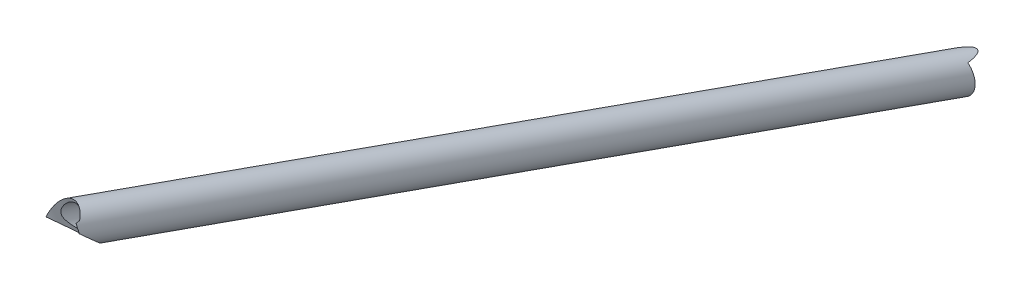
ISO-10303-21;
HEADER;
FILE_DESCRIPTION(('STEP AP214'),'2;1');
FILE_NAME('part.step','',(''),(''),'','','');
FILE_SCHEMA(('AUTOMOTIVE_DESIGN { 1 0 10303 214 1 1 1 1 }'));
ENDSEC;
DATA;
#1=APPLICATION_CONTEXT('core data for automotive mechanical design processes');
#2=APPLICATION_PROTOCOL_DEFINITION('international standard','automotive_design',2000,#1);
#3=PRODUCT_CONTEXT('',#1,'mechanical');
#4=PRODUCT('Part','Part','',(#3));
#5=PRODUCT_RELATED_PRODUCT_CATEGORY('part','',(#4));
#6=PRODUCT_DEFINITION_FORMATION('','',#4);
#7=PRODUCT_DEFINITION_CONTEXT('part definition',#1,'design');
#8=PRODUCT_DEFINITION('design','',#6,#7);
#9=PRODUCT_DEFINITION_SHAPE('','',#8);
#10=(LENGTH_UNIT() NAMED_UNIT(*) SI_UNIT(.MILLI.,.METRE.));
#11=(NAMED_UNIT(*) PLANE_ANGLE_UNIT() SI_UNIT($,.RADIAN.));
#12=(NAMED_UNIT(*) SI_UNIT($,.STERADIAN.) SOLID_ANGLE_UNIT());
#13=UNCERTAINTY_MEASURE_WITH_UNIT(LENGTH_MEASURE(1.E-05),#10,'distance_accuracy_value','');
#14=(GEOMETRIC_REPRESENTATION_CONTEXT(3) GLOBAL_UNCERTAINTY_ASSIGNED_CONTEXT((#13)) GLOBAL_UNIT_ASSIGNED_CONTEXT((#10,
#11,#12)) REPRESENTATION_CONTEXT('',''));
#15=CARTESIAN_POINT('',(0.,0.,0.));
#16=DIRECTION('',(0.,0.,1.));
#17=DIRECTION('',(1.,0.,0.));
#18=AXIS2_PLACEMENT_3D('',#15,#16,#17);
#19=CARTESIAN_POINT('',(-324.999999999997,320.000000000001,-1580.));
#20=DIRECTION('',(0.1711521568645,-0.228202875819355,-0.958452078441278));
#21=DIRECTION('',(0.,0.972806214685366,-0.231620527306043));
#22=AXIS2_PLACEMENT_3D('',#19,#20,#21);
#23=CYLINDRICAL_SURFACE('',#22,7.90000000000002);
#24=CARTESIAN_POINT('',(-323.966645789436,326.307363481934,-1587.61658574486));
#25=CARTESIAN_POINT('',(-324.175612977549,326.296705939446,-1587.66135152366));
#26=CARTESIAN_POINT('',(-324.385130251522,326.278194307406,-1587.70161499438));
#27=CARTESIAN_POINT('',(-324.803806167485,326.225592666959,-1587.77270181412));
#28=CARTESIAN_POINT('',(-325.012964831545,326.191503654473,-1587.80352576643));
#29=CARTESIAN_POINT('',(-325.429331243801,326.108009417741,-1587.85546586048));
#30=CARTESIAN_POINT('',(-325.636539738196,326.058610319407,-1587.87658587662));
#31=CARTESIAN_POINT('',(-326.047590361872,325.944851065946,-1587.90907319574));
#32=CARTESIAN_POINT('',(-326.251432413656,325.880490566916,-1587.9204402745));
#33=CARTESIAN_POINT('',(-326.654114025761,325.737328672349,-1587.93354626768));
#34=CARTESIAN_POINT('',(-326.852957366613,325.658538587955,-1587.9352926905));
#35=CARTESIAN_POINT('',(-327.24439696723,325.487029008777,-1587.92950186717));
#36=CARTESIAN_POINT('',(-327.436993248957,325.39430956297,-1587.92196465367));
#37=CARTESIAN_POINT('',(-327.814648256425,325.195520249694,-1587.89812019173));
#38=CARTESIAN_POINT('',(-327.999705415689,325.089447626242,-1587.88181113057));
#39=CARTESIAN_POINT('',(-328.360996222015,324.864592696473,-1587.84113024388));
#40=CARTESIAN_POINT('',(-328.537229771889,324.745810250209,-1587.81675832955));
#41=CARTESIAN_POINT('',(-328.883171108338,324.493634702971,-1587.76029145554));
#42=CARTESIAN_POINT('',(-329.052675275293,324.359995014688,-1587.72805048995));
#43=CARTESIAN_POINT('',(-329.380138189812,324.08075112603,-1587.6573038662));
#44=CARTESIAN_POINT('',(-329.538096290604,323.935146256375,-1587.61879785748));
#45=CARTESIAN_POINT('',(-329.84141176635,323.632473136908,-1587.53695436931));
#46=CARTESIAN_POINT('',(-329.986763322365,323.475399654368,-1587.49361467959));
#47=CARTESIAN_POINT('',(-330.263661653931,323.150348624936,-1587.40388851808));
#48=CARTESIAN_POINT('',(-330.395210073406,322.982372380406,-1587.35750241018));
#49=CARTESIAN_POINT('',(-330.627647246448,322.657865698545,-1587.2697847315));
#50=CARTESIAN_POINT('',(-330.730309351337,322.502575668912,-1587.22855610938));
#51=CARTESIAN_POINT('',(-330.923382739677,322.184285333027,-1587.14720228871));
#52=CARTESIAN_POINT('',(-331.013795796986,322.021286147808,-1587.10707693107));
#53=CARTESIAN_POINT('',(-331.181361251165,321.688116000308,-1587.03009063708));
#54=CARTESIAN_POINT('',(-331.25853044095,321.517954465976,-1586.99322559592));
#55=CARTESIAN_POINT('',(-331.398745391079,321.170803260724,-1586.92521090062));
#56=CARTESIAN_POINT('',(-331.461795592922,320.993815757687,-1586.89405944967));
#57=CARTESIAN_POINT('',(-331.559469854148,320.677103613812,-1586.84676427926));
#58=CARTESIAN_POINT('',(-331.597284526233,320.538629583804,-1586.82881302873));
#59=CARTESIAN_POINT('',(-331.66380941228,320.258867262344,-1586.7991638688));
#60=CARTESIAN_POINT('',(-331.692522238742,320.11757979083,-1586.78746416437));
#61=CARTESIAN_POINT('',(-331.740548139849,319.833230407489,-1586.77157067904));
#62=CARTESIAN_POINT('',(-331.759877165925,319.690171933828,-1586.76736412787));
#63=CARTESIAN_POINT('',(-331.789143741971,319.403088289108,-1586.76744607019));
#64=CARTESIAN_POINT('',(-331.79908142147,319.259063131411,-1586.7717344465));
#65=CARTESIAN_POINT('',(-331.809779255778,318.97082322096,-1586.78949122765));
#66=CARTESIAN_POINT('',(-331.810513222828,318.826609094365,-1586.80298571225));
#67=CARTESIAN_POINT('',(-331.803221828405,318.539605173905,-1586.83936643546));
#68=CARTESIAN_POINT('',(-331.795196490313,318.39681537624,-1586.86225264899));
#69=CARTESIAN_POINT('',(-331.771095616484,318.113555315602,-1586.91714650043));
#70=CARTESIAN_POINT('',(-331.755011834645,317.973087581173,-1586.94916346722));
#71=CARTESIAN_POINT('',(-331.715644776623,317.695355713713,-1587.0216286884));
#72=CARTESIAN_POINT('',(-331.692358975419,317.558092722443,-1587.0620798982));
#73=CARTESIAN_POINT('',(-331.627381771764,317.225349170743,-1587.17071740639));
#74=CARTESIAN_POINT('',(-331.582142543629,317.031937840523,-1587.24312942584));
#75=CARTESIAN_POINT('',(-331.48073883416,316.653416466329,-1587.40082231095));
#76=CARTESIAN_POINT('',(-331.424567929073,316.468311382421,-1587.48611073649));
#77=CARTESIAN_POINT('',(-331.303062809019,316.10552455763,-1587.6669629705));
#78=CARTESIAN_POINT('',(-331.237697980701,315.927870302185,-1587.76256084794));
#79=CARTESIAN_POINT('',(-331.099355498989,315.57992465588,-1587.96142327384));
#80=CARTESIAN_POINT('',(-331.026374644023,315.409636404385,-1588.06469104121));
#81=CARTESIAN_POINT('',(-330.869346515212,315.065978962611,-1588.28315551532));
#82=CARTESIAN_POINT('',(-330.784901583514,314.893012513581,-1588.39869665499));
#83=CARTESIAN_POINT('',(-330.609396325319,314.5537828984,-1588.63440289004));
#84=CARTESIAN_POINT('',(-330.518336737156,314.387518987317,-1588.75456746864));
#85=CARTESIAN_POINT('',(-330.329960548347,314.0608129571,-1588.9982980938));
#86=CARTESIAN_POINT('',(-330.232637111931,313.90037750775,-1589.12186776934));
#87=CARTESIAN_POINT('',(-330.032087887043,313.584992365596,-1589.3711879964));
#88=CARTESIAN_POINT('',(-329.928862027547,313.43004273884,-1589.49693857415));
#89=CARTESIAN_POINT('',(-329.716512415595,313.12508960845,-1589.74985250671));
#90=CARTESIAN_POINT('',(-329.607382739479,312.975091325141,-1589.87701717481));
#91=CARTESIAN_POINT('',(-329.383309350441,312.679940512798,-1590.13187726606));
#92=CARTESIAN_POINT('',(-329.268365139566,312.534788400561,-1590.2595727338));
#93=CARTESIAN_POINT('',(-329.032661263379,312.249314250809,-1590.51470753869));
#94=CARTESIAN_POINT('',(-328.911905950003,312.108988729665,-1590.64214699527));
#95=CARTESIAN_POINT('',(-328.66432736469,311.833041543756,-1590.89622315239));
#96=CARTESIAN_POINT('',(-328.537503991733,311.697419957367,-1591.02285983952));
#97=CARTESIAN_POINT('',(-328.21896599129,311.370924541441,-1591.33145518049));
#98=CARTESIAN_POINT('',(-328.02376110602,311.18268999951,-1591.51263017509));
#99=CARTESIAN_POINT('',(-327.619033451953,310.817000070192,-1591.86998291677));
#100=CARTESIAN_POINT('',(-327.409507647644,310.639546983229,-1592.04615959312));
#101=CARTESIAN_POINT('',(-326.975472741132,310.297301149023,-1592.39065031246));
#102=CARTESIAN_POINT('',(-326.751005438524,310.132475645248,-1592.55898422181));
#103=CARTESIAN_POINT('',(-326.285134459935,309.817182125931,-1592.8852884936));
#104=CARTESIAN_POINT('',(-326.043740629931,309.666705881853,-1593.04326477915));
#105=CARTESIAN_POINT('',(-325.648985875741,309.443658648031,-1593.28074583644));
#106=CARTESIAN_POINT('',(-325.501840267455,309.365169453412,-1593.36505341305));
#107=CARTESIAN_POINT('',(-325.201117663896,309.214899900372,-1593.52794402021));
#108=CARTESIAN_POINT('',(-325.047542373841,309.143117779285,-1593.60652855361));
#109=CARTESIAN_POINT('',(-324.733741747988,309.007324624023,-1593.75679221043));
#110=CARTESIAN_POINT('',(-324.573518518028,308.943311153847,-1593.82847349702));
#111=CARTESIAN_POINT('',(-324.246371289823,308.824371584972,-1593.96348645221));
#112=CARTESIAN_POINT('',(-324.079449130466,308.769443013343,-1594.026820392));
#113=CARTESIAN_POINT('',(-323.65147324859,308.644704220827,-1594.17344660598));
#114=CARTESIAN_POINT('',(-323.386076249314,308.581724607388,-1594.25029977602));
#115=CARTESIAN_POINT('',(-322.842989705133,308.486749593738,-1594.37377645335));
#116=CARTESIAN_POINT('',(-322.565322666784,308.45469974109,-1594.42045303906));
#117=CARTESIAN_POINT('',(-322.054925997661,308.430486618372,-1594.47125228855));
#118=CARTESIAN_POINT('',(-321.823132172699,308.432167732615,-1594.48153545433));
#119=CARTESIAN_POINT('',(-321.361846473166,308.463088898371,-1594.47403369806));
#120=CARTESIAN_POINT('',(-321.132353023232,308.492308571524,-1594.45626952431));
#121=CARTESIAN_POINT('',(-320.682460385862,308.578315843677,-1594.39226448898));
#122=CARTESIAN_POINT('',(-320.46207042709,308.635130707489,-1594.34599545164));
#123=CARTESIAN_POINT('',(-320.036634042799,308.773618622983,-1594.22746717292));
#124=CARTESIAN_POINT('',(-319.831599940044,308.855311377916,-1594.15518732275));
#125=CARTESIAN_POINT('',(-319.386800679413,309.064513183652,-1593.96613279026));
#126=CARTESIAN_POINT('',(-319.152971552986,309.198443485061,-1593.84258932957));
#127=CARTESIAN_POINT('',(-318.717551677069,309.49050231094,-1593.56996388295));
#128=CARTESIAN_POINT('',(-318.516027681316,309.648679652641,-1593.42083030176));
#129=CARTESIAN_POINT('',(-318.183055775344,309.946133438338,-1593.13891242488));
#130=CARTESIAN_POINT('',(-318.04583371688,310.082231557854,-1593.00943889128));
#131=CARTESIAN_POINT('',(-317.788227544249,310.362384426669,-1592.74245067169));
#132=CARTESIAN_POINT('',(-317.667853755288,310.506443980246,-1592.60493112737));
#133=CARTESIAN_POINT('',(-317.442132925257,310.800840149884,-1592.32387058368));
#134=CARTESIAN_POINT('',(-317.336811701034,310.951186991932,-1592.1803197728));
#135=CARTESIAN_POINT('',(-317.139793334317,311.256697896399,-1591.88898098236));
#136=CARTESIAN_POINT('',(-317.048101353312,311.411863757056,-1591.7411914227));
#137=CARTESIAN_POINT('',(-316.883534442451,311.714047712312,-1591.45407601125));
#138=CARTESIAN_POINT('',(-316.809757302504,311.860783278972,-1591.31496555731));
#139=CARTESIAN_POINT('',(-316.67173259803,312.157068565761,-1591.03498909851));
#140=CARTESIAN_POINT('',(-316.60748669835,312.306618772402,-1590.89412279159));
#141=CARTESIAN_POINT('',(-316.487702945422,312.60826323932,-1590.61120645477));
#142=CARTESIAN_POINT('',(-316.432171108207,312.76035917765,-1590.46915567778));
#143=CARTESIAN_POINT('',(-316.329201042558,313.066780031395,-1590.18451280989));
#144=CARTESIAN_POINT('',(-316.281763759281,313.221105204825,-1590.04192065778));
#145=CARTESIAN_POINT('',(-316.150537683598,313.687911826181,-1589.61344114924));
#146=CARTESIAN_POINT('',(-316.078092646996,314.003560342434,-1589.32747674906));
#147=CARTESIAN_POINT('',(-315.960137102145,314.642867596384,-1588.75940827293));
#148=CARTESIAN_POINT('',(-315.914613515385,314.966522364873,-1588.47730238768));
#149=CARTESIAN_POINT('',(-315.855278432123,315.556399920046,-1587.97751953436));
#150=CARTESIAN_POINT('',(-315.836904586012,315.820939564418,-1587.75839174109));
#151=CARTESIAN_POINT('',(-315.815730245232,316.357043138838,-1587.32788917603));
#152=CARTESIAN_POINT('',(-315.812935121072,316.62860945881,-1587.11651710286));
#153=CARTESIAN_POINT('',(-315.823269721574,317.179372946223,-1586.70605752242));
#154=CARTESIAN_POINT('',(-315.836347935384,317.458542572167,-1586.50693247072));
#155=CARTESIAN_POINT('',(-315.868820568355,317.884927696916,-1586.22132005617));
#156=CARTESIAN_POINT('',(-315.881781928041,318.028286824147,-1586.12831921839));
#157=CARTESIAN_POINT('',(-315.912279156255,318.317833934134,-1585.94764508389));
#158=CARTESIAN_POINT('',(-315.929814147617,318.464021369484,-1585.85997076958));
#159=CARTESIAN_POINT('',(-315.969407882143,318.756347019322,-1585.69289482091));
#160=CARTESIAN_POINT('',(-315.991363539985,318.902421388794,-1585.61335781652));
#161=CARTESIAN_POINT('',(-316.040458216632,319.197581159026,-1585.46188171627));
#162=CARTESIAN_POINT('',(-316.067595632314,319.346665615808,-1585.38994028115));
#163=CARTESIAN_POINT('',(-316.127568921342,319.647646092686,-1585.25529704515));
#164=CARTESIAN_POINT('',(-316.160397920216,319.799538525739,-1585.19258426464));
#165=CARTESIAN_POINT('',(-316.232396442551,320.105936917607,-1585.07807389027));
#166=CARTESIAN_POINT('',(-316.27156476424,320.260442376097,-1585.02627423185));
#167=CARTESIAN_POINT('',(-316.350438126193,320.547797036792,-1584.94224046715));
#168=CARTESIAN_POINT('',(-316.389168764802,320.680392888008,-1584.90823295765));
#169=CARTESIAN_POINT('',(-316.472011982751,320.946100486204,-1584.85033378193));
#170=CARTESIAN_POINT('',(-316.516123177732,321.079212091988,-1584.82643952073));
#171=CARTESIAN_POINT('',(-316.609962282548,321.344826227171,-1584.78944283766));
#172=CARTESIAN_POINT('',(-316.659684840977,321.477329213539,-1584.77633023089));
#173=CARTESIAN_POINT('',(-316.764931077913,321.740660079066,-1584.76108593662));
#174=CARTESIAN_POINT('',(-316.8204548217,321.871487939356,-1584.75895437269));
#175=CARTESIAN_POINT('',(-316.937309370938,322.130222679651,-1584.76538861047));
#176=CARTESIAN_POINT('',(-316.998639217344,322.258130037746,-1584.77395264834));
#177=CARTESIAN_POINT('',(-317.127016751923,322.509946879285,-1584.80101905618));
#178=CARTESIAN_POINT('',(-317.194064533291,322.633856297524,-1584.81952158817));
#179=CARTESIAN_POINT('',(-317.333827930131,322.877006619953,-1584.8654065194));
#180=CARTESIAN_POINT('',(-317.406553077721,322.99623914478,-1584.89280410775));
#181=CARTESIAN_POINT('',(-317.557379298017,323.229203629308,-1584.95519196755));
#182=CARTESIAN_POINT('',(-317.635481806633,323.342934105891,-1584.9901842724));
#183=CARTESIAN_POINT('',(-317.825936814209,323.604391915604,-1585.08018196015));
#184=CARTESIAN_POINT('',(-317.940490438087,323.749603869139,-1585.13785544733));
#185=CARTESIAN_POINT('',(-318.178681272473,324.028515561493,-1585.26167200673));
#186=CARTESIAN_POINT('',(-318.302321687872,324.162211202073,-1585.32781807338));
#187=CARTESIAN_POINT('',(-318.558351250158,324.417973241706,-1585.46590329899));
#188=CARTESIAN_POINT('',(-318.690748938683,324.540027994575,-1585.53784812932));
#189=CARTESIAN_POINT('',(-318.963750725271,324.77226389219,-1585.68515294859));
#190=CARTESIAN_POINT('',(-319.104354120496,324.882446051553,-1585.76051264491));
#191=CARTESIAN_POINT('',(-319.396934327887,325.093479941638,-1585.91460055078));
#192=CARTESIAN_POINT('',(-319.549106420035,325.194033531027,-1585.99336597534));
#193=CARTESIAN_POINT('',(-319.861145504983,325.382553673918,-1586.15070030944));
#194=CARTESIAN_POINT('',(-320.021012463061,325.470520284211,-1586.22926921987));
#195=CARTESIAN_POINT('',(-320.347889832584,325.633746036496,-1586.38471611423));
#196=CARTESIAN_POINT('',(-320.514899959193,325.709005684592,-1586.4615941654));
#197=CARTESIAN_POINT('',(-320.855439775348,325.846667157938,-1586.61237385235));
#198=CARTESIAN_POINT('',(-321.028969832074,325.909068257752,-1586.68627532001));
#199=CARTESIAN_POINT('',(-321.42231214955,326.033651136147,-1586.84645347296));
#200=CARTESIAN_POINT('',(-321.643616388929,326.092504629312,-1586.93168437677));
#201=CARTESIAN_POINT('',(-322.093506321026,326.190186091479,-1587.09414204081));
#202=CARTESIAN_POINT('',(-322.322093290174,326.229010529295,-1587.17136738772));
#203=CARTESIAN_POINT('',(-322.784783519134,326.286356406959,-1587.31628949338));
#204=CARTESIAN_POINT('',(-323.018886858956,326.304877552143,-1587.38398611382));
#205=CARTESIAN_POINT('',(-323.49063720932,326.32145777642,-1587.50860191757));
#206=CARTESIAN_POINT('',(-323.728283634652,326.319520198091,-1587.56552285987));
#207=CARTESIAN_POINT('',(-323.966645789436,326.307363481934,-1587.61658574486));
#208=B_SPLINE_CURVE_WITH_KNOTS('',3,(#24,#25,#26,#27,#28,#29,#30,#31,#32,#33,#34,#35,#36,#37,
#38,#39,#40,#41,#42,#43,#44,#45,#46,#47,#48,#49,#50,#51,#52,#53,#54,#55,#56,#57,#58,#59,#60,#61,
#62,#63,#64,#65,#66,#67,#68,#69,#70,#71,#72,#73,#74,#75,#76,#77,#78,#79,#80,#81,#82,#83,#84,#85,
#86,#87,#88,#89,#90,#91,#92,#93,#94,#95,#96,#97,#98,#99,#100,#101,#102,#103,#104,#105,#106,#107,
#108,#109,#110,#111,#112,#113,#114,#115,#116,#117,#118,#119,#120,#121,#122,#123,#124,#125,#126,
#127,#128,#129,#130,#131,#132,#133,#134,#135,#136,#137,#138,#139,#140,#141,#142,#143,#144,#145,
#146,#147,#148,#149,#150,#151,#152,#153,#154,#155,#156,#157,#158,#159,#160,#161,#162,#163,#164,
#165,#166,#167,#168,#169,#170,#171,#172,#173,#174,#175,#176,#177,#178,#179,#180,#181,#182,#183,
#184,#185,#186,#187,#188,#189,#190,#191,#192,#193,#194,#195,#196,#197,#198,#199,#200,#201,#202,
#203,#204,#205,#206,#207),.UNSPECIFIED.,.T.,.F.,(4,2,2,2,2,2,2,2,2,2,2,2,2,2,2,2,2,2,2,2,2,2,2,
2,2,2,2,2,2,2,2,2,2,2,2,2,2,2,2,2,2,2,2,2,2,2,2,2,2,2,2,2,2,2,2,2,2,2,2,2,2,2,2,2,2,2,2,2,2,2,2,
2,2,2,2,2,2,2,2,2,2,2,2,2,2,2,2,2,2,2,2,4),(0.,0.641704329611858,1.28336763838417,
1.9247745338699,2.56619617417216,3.20711714888528,3.84803587010686,4.4890870890482,
5.13014536727584,5.78414780113105,6.43818684201444,7.09252618571568,7.74678751032433,
8.31827836305462,8.88968636604454,9.46036439629935,10.030862651785,10.4644506860705,
10.8979141547717,11.3306381803332,11.7633562374894,12.1973052494242,12.6312531030776,
13.0656459197607,13.5001912070719,14.1333716373086,14.7669252713596,15.4026407395491,
16.0386245303213,16.7118211956778,17.3849428332672,18.0588119339343,18.7326891450878,
19.4072555127849,20.08187974817,20.7560063898021,21.4301442582081,22.4080415295191,
23.3861467260692,24.3616221326296,25.3365347489841,25.8968804295848,26.4570784306394,
27.0171003151638,27.5769695087205,28.4241783998819,29.2698930277613,29.9629478102968,
30.655490139005,31.3487181149285,32.0424965605373,32.9268983269328,33.813104655153,
34.5100405948837,35.2074017884905,35.9059450397207,36.6047521638568,37.2502009575915,
37.8957623611373,38.541767506181,39.1878480301277,40.4828470291265,41.7772163962967,
42.8087527674546,43.840644721992,44.8691969999012,45.3831866347858,45.8970777652996,
46.4001426450299,46.9030521389417,47.4053583817463,47.9075695114377,48.3339353794479,
48.7601917785987,49.1860450500361,49.6119031140239,50.0376909575123,50.4634857420238,
50.8900114680439,51.316651533783,51.8970135845176,52.477581319132,53.0587239231647,
53.6398168239458,54.2352807580679,54.8307420054731,55.4261795307614,56.0216506394541,
56.7536021247077,57.4856826112603,58.2177737224595,58.9497452253595),.UNSPECIFIED.);
#209=CARTESIAN_POINT('',(-323.966645789436,326.307363481934,-1587.61658574486));
#210=VERTEX_POINT('',#209);
#211=EDGE_CURVE('E93',#210,#210,#208,.T.);
#212=ORIENTED_EDGE('',*,*,#211,.T.);
#213=EDGE_LOOP('',(#212));
#214=FACE_BOUND('',#213,.T.);
#215=CARTESIAN_POINT('',(-257.500000000002,229.999999999999,-1958.));
#216=DIRECTION('',(0.,-1.,0.));
#217=DIRECTION('',(0.175790638483645,0.,-0.984427575508484));
#218=AXIS2_PLACEMENT_3D('',#215,#216,#217);
#219=ELLIPSE('',#218,34.6183192110767,7.90000000000002);
#220=CARTESIAN_POINT('',(-254.86714985845,229.999999999999,-1990.));
#221=VERTEX_POINT('',#220);
#222=CARTESIAN_POINT('',(-249.317399497779,229.999999999999,-1990.));
#223=VERTEX_POINT('',#222);
#224=EDGE_CURVE('E82',#221,#223,#219,.T.);
#225=ORIENTED_EDGE('',*,*,#224,.T.);
#226=CARTESIAN_POINT('',(-251.785714285717,222.380952380952,-1990.));
#227=DIRECTION('',(0.,0.,-1.));
#228=DIRECTION('',(0.599999999999997,-0.800000000000002,0.));
#229=AXIS2_PLACEMENT_3D('',#226,#227,#228);
#230=ELLIPSE('',#229,8.24245695501827,7.90000000000002);
#231=EDGE_CURVE('E86',#223,#221,#230,.T.);
#232=ORIENTED_EDGE('',*,*,#231,.T.);
#233=EDGE_LOOP('',(#225,#232));
#234=FACE_BOUND('',#233,.T.);
#235=ADVANCED_FACE('F41',(#214,#234),#23,.F.);
#236=CARTESIAN_POINT('',(-250.,1.11022302462516E-13,-1700.));
#237=DIRECTION('',(-0.214351342090099,0.914565726251125,0.342962147344171));
#238=DIRECTION('',(0.,-0.351123441588388,0.936329177569046));
#239=AXIS2_PLACEMENT_3D('',#236,#237,#238);
#240=CYLINDRICAL_SURFACE('',#239,9.49999999999999);
#241=ORIENTED_EDGE('',*,*,#211,.F.);
#242=EDGE_LOOP('',(#241));
#243=FACE_BOUND('',#242,.T.);
#244=CARTESIAN_POINT('',(-324.999999999997,320.000000000001,-1580.));
#245=DIRECTION('',(0.217268286027566,-0.644059979147456,-0.73347204114896));
#246=DIRECTION('',(-0.046806891515569,0.743683273485424,-0.666891523146497));
#247=AXIS2_PLACEMENT_3D('',#244,#245,#246);
#248=ELLIPSE('',#247,10.7083267615423,9.49999999999999);
#249=CARTESIAN_POINT('',(-316.850455147289,324.957595377925,-1581.93920293328));
#250=VERTEX_POINT('',#249);
#251=CARTESIAN_POINT('',(-334.262395776096,318.29735371763,-1581.24860727374));
#252=VERTEX_POINT('',#251);
#253=EDGE_CURVE('E103',#250,#252,#248,.F.);
#254=ORIENTED_EDGE('',*,*,#253,.T.);
#255=CARTESIAN_POINT('',(-324.999999999997,320.000000000001,-1580.));
#256=DIRECTION('',(-0.046806891515569,0.743683273485424,-0.666891523146497));
#257=DIRECTION('',(0.217268286027566,-0.644059979147456,-0.73347204114896));
#258=AXIS2_PLACEMENT_3D('',#255,#256,#257);
#259=ELLIPSE('',#258,20.5867526008063,9.49999999999999);
#260=CARTESIAN_POINT('',(-315.341374922448,320.385714809066,-1580.24777727505));
#261=VERTEX_POINT('',#260);
#262=EDGE_CURVE('E129',#252,#261,#259,.F.);
#263=ORIENTED_EDGE('',*,*,#262,.T.);
#264=CARTESIAN_POINT('',(-324.999999999997,320.000000000001,-1580.));
#265=DIRECTION('',(0.0100583123703715,0.349879267870482,0.936740801004566));
#266=DIRECTION('',(-0.287052887423583,0.898369431045867,-0.332465043552114));
#267=AXIS2_PLACEMENT_3D('',#264,#265,#266);
#268=ELLIPSE('',#267,14.8646950385778,9.49999999999999);
#269=EDGE_CURVE('E127',#261,#250,#268,.T.);
#270=ORIENTED_EDGE('',*,*,#269,.T.);
#271=EDGE_LOOP('',(#254,#263,#270));
#272=FACE_BOUND('',#271,.T.);
#273=ADVANCED_FACE('F43',(#243,#272),#240,.F.);
#274=CARTESIAN_POINT('',(-324.999999999997,320.000000000001,-1580.));
#275=DIRECTION('',(0.227207840964855,-0.467351298219698,0.854376592057889));
#276=DIRECTION('',(0.,-0.877321812102289,-0.479902529696974));
#277=AXIS2_PLACEMENT_3D('',#274,#275,#276);
#278=CYLINDRICAL_SURFACE('',#277,9.49999999999999);
#279=CARTESIAN_POINT('',(-324.999999999997,320.000000000001,-1580.));
#280=DIRECTION('',(0.492848464858464,-0.860535216309271,-0.128761532214446));
#281=DIRECTION('',(-0.0306416701609206,0.130725495483686,-0.990944969652853));
#282=AXIS2_PLACEMENT_3D('',#279,#280,#281);
#283=ELLIPSE('',#282,23.5066795946768,9.49999999999999);
#284=CARTESIAN_POINT('',(-316.749201071933,324.717084971521,-1579.94427024051));
#285=VERTEX_POINT('',#284);
#286=EDGE_CURVE('E150',#285,#250,#283,.F.);
#287=ORIENTED_EDGE('',*,*,#286,.T.);
#288=ORIENTED_EDGE('',*,*,#269,.F.);
#289=CARTESIAN_POINT('',(-324.999999999997,320.000000000001,-1580.));
#290=DIRECTION('',(-0.0306416701609206,0.130725495483686,-0.990944969652853));
#291=DIRECTION('',(0.492848464858464,-0.860535216309271,-0.128761532214446));
#292=AXIS2_PLACEMENT_3D('',#289,#290,#291);
#293=ELLIPSE('',#292,10.3859535817137,9.49999999999999);
#294=CARTESIAN_POINT('',(-316.09829094194,323.366491923368,-1579.83114794765));
#295=VERTEX_POINT('',#294);
#296=EDGE_CURVE('E143',#261,#295,#293,.F.);
#297=ORIENTED_EDGE('',*,*,#296,.T.);
#298=CARTESIAN_POINT('',(-316.749201071933,324.717084971521,-1579.94427024051));
#299=CARTESIAN_POINT('',(-316.717866345015,324.662994080016,-1579.93932436288));
#300=CARTESIAN_POINT('',(-316.687044902629,324.60860398095,-1579.93439890331));
#301=CARTESIAN_POINT('',(-316.626439015826,324.499244843627,-1579.92459531971));
#302=CARTESIAN_POINT('',(-316.596654571408,324.444275805371,-1579.91971719568));
#303=CARTESIAN_POINT('',(-316.538133109441,324.333778265601,-1579.9100147826));
#304=CARTESIAN_POINT('',(-316.509396091892,324.278249764087,-1579.90519049354));
#305=CARTESIAN_POINT('',(-316.452979414596,324.166653042177,-1579.89560222483));
#306=CARTESIAN_POINT('',(-316.425299754848,324.110584821779,-1579.89083824518));
#307=CARTESIAN_POINT('',(-316.371007357256,323.997928592573,-1579.88137704849));
#308=CARTESIAN_POINT('',(-316.344394619412,323.941340583763,-1579.87667983145));
#309=CARTESIAN_POINT('',(-316.292245213887,323.827664910796,-1579.86735858721));
#310=CARTESIAN_POINT('',(-316.266708546207,323.770577246639,-1579.86273456001));
#311=CARTESIAN_POINT('',(-316.216720056822,323.655922570106,-1579.85356609756));
#312=CARTESIAN_POINT('',(-316.192268235118,323.59835555773,-1579.84902166232));
#313=CARTESIAN_POINT('',(-316.144457695866,323.482762718236,-1579.84001874741));
#314=CARTESIAN_POINT('',(-316.121098978319,323.424736891119,-1579.83556026774));
#315=CARTESIAN_POINT('',(-316.09829094194,323.366491923368,-1579.83114794765));
#316=B_SPLINE_CURVE_WITH_KNOTS('',3,(#298,#299,#300,#301,#302,#303,#304,#305,#306,#307,#308,
#309,#310,#311,#312,#313,#314,#315),.UNSPECIFIED.,.F.,.F.,(4,2,2,2,2,2,2,2,4),(0.,
0.188117784783492,0.376235569567016,0.564353354350535,0.752471139134021,0.940588923917529,
1.12870670870103,1.31682449348455,1.50494227826805),.UNSPECIFIED.);
#317=EDGE_CURVE('E96',#285,#295,#316,.T.);
#318=ORIENTED_EDGE('',*,*,#317,.F.);
#319=EDGE_LOOP('',(#287,#288,#297,#318));
#320=FACE_BOUND('',#319,.T.);
#321=ADVANCED_FACE('F111',(#320),#278,.F.);
#322=CARTESIAN_POINT('',(-324.999999999997,320.000000000001,-1580.));
#323=DIRECTION('',(0.1711521568645,-0.228202875819355,-0.958452078441278));
#324=DIRECTION('',(0.,0.972806214685366,-0.231620527306043));
#325=AXIS2_PLACEMENT_3D('',#322,#323,#324);
#326=CYLINDRICAL_SURFACE('',#325,9.49999999999999);
#327=ORIENTED_EDGE('',*,*,#286,.F.);
#328=ORIENTED_EDGE('',*,*,#317,.T.);
#329=ORIENTED_EDGE('',*,*,#296,.F.);
#330=ORIENTED_EDGE('',*,*,#262,.F.);
#331=ORIENTED_EDGE('',*,*,#253,.F.);
#332=EDGE_LOOP('',(#327,#328,#329,#330,#331));
#333=FACE_BOUND('',#332,.T.);
#334=CARTESIAN_POINT('',(-251.785714285717,222.380952380952,-1990.));
#335=DIRECTION('',(0.,0.,-1.));
#336=DIRECTION('',(0.599999999999997,-0.800000000000002,0.));
#337=AXIS2_PLACEMENT_3D('',#334,#335,#336);
#338=ELLIPSE('',#337,9.91181532565485,9.49999999999999);
#339=CARTESIAN_POINT('',(-246.060686079594,229.999999999999,-1990.));
#340=VERTEX_POINT('',#339);
#341=CARTESIAN_POINT('',(-258.123863276635,229.999999999999,-1990.));
#342=VERTEX_POINT('',#341);
#343=EDGE_CURVE('E11',#340,#342,#338,.T.);
#344=ORIENTED_EDGE('',*,*,#343,.F.);
#345=CARTESIAN_POINT('',(-257.500000000002,229.999999999999,-1958.));
#346=DIRECTION('',(0.,-1.,0.));
#347=DIRECTION('',(0.175790638483645,0.,-0.984427575508484));
#348=AXIS2_PLACEMENT_3D('',#345,#346,#347);
#349=ELLIPSE('',#348,41.6296243677503,9.49999999999999);
#350=EDGE_CURVE('E50',#342,#340,#349,.T.);
#351=ORIENTED_EDGE('',*,*,#350,.F.);
#352=EDGE_LOOP('',(#344,#351));
#353=FACE_BOUND('',#352,.T.);
#354=ADVANCED_FACE('F114',(#333,#353),#326,.T.);
#355=CARTESIAN_POINT('',(-250.000000000003,229.999999999999,-1990.));
#356=DIRECTION('',(0.,-1.,0.));
#357=DIRECTION('',(0.,0.,-1.));
#358=AXIS2_PLACEMENT_3D('',#355,#356,#357);
#359=PLANE('',#358);
#360=DIRECTION('',(1.,0.,0.));
#361=VECTOR('',#360,1.);
#362=CARTESIAN_POINT('',(-250.000000000003,229.999999999999,-1990.));
#363=LINE('',#362,#361);
#364=EDGE_CURVE('E62',#342,#221,#363,.T.);
#365=ORIENTED_EDGE('',*,*,#364,.F.);
#366=ORIENTED_EDGE('',*,*,#350,.T.);
#367=EDGE_CURVE('E57',#223,#340,#363,.T.);
#368=ORIENTED_EDGE('',*,*,#367,.F.);
#369=ORIENTED_EDGE('',*,*,#224,.F.);
#370=EDGE_LOOP('',(#365,#366,#368,#369));
#371=FACE_BOUND('',#370,.T.);
#372=ADVANCED_FACE('F83',(#371),#359,.T.);
#373=CARTESIAN_POINT('',(-250.000000000003,209.999999999999,-1990.));
#374=DIRECTION('',(0.,0.,-1.));
#375=DIRECTION('',(-1.,0.,0.));
#376=AXIS2_PLACEMENT_3D('',#373,#374,#375);
#377=PLANE('',#376);
#378=ORIENTED_EDGE('',*,*,#367,.T.);
#379=ORIENTED_EDGE('',*,*,#343,.T.);
#380=ORIENTED_EDGE('',*,*,#364,.T.);
#381=ORIENTED_EDGE('',*,*,#231,.F.);
#382=EDGE_LOOP('',(#378,#379,#380,#381));
#383=FACE_BOUND('',#382,.T.);
#384=ADVANCED_FACE('F89',(#383),#377,.T.);
#385=CLOSED_SHELL('',(#235,#273,#321,#354,#372,#384));
#386=MANIFOLD_SOLID_BREP('B2',#385);
#387=ADVANCED_BREP_SHAPE_REPRESENTATION('',(#18,#386),#14);
#388=SHAPE_DEFINITION_REPRESENTATION(#9,#387);
ENDSEC;
END-ISO-10303-21;
